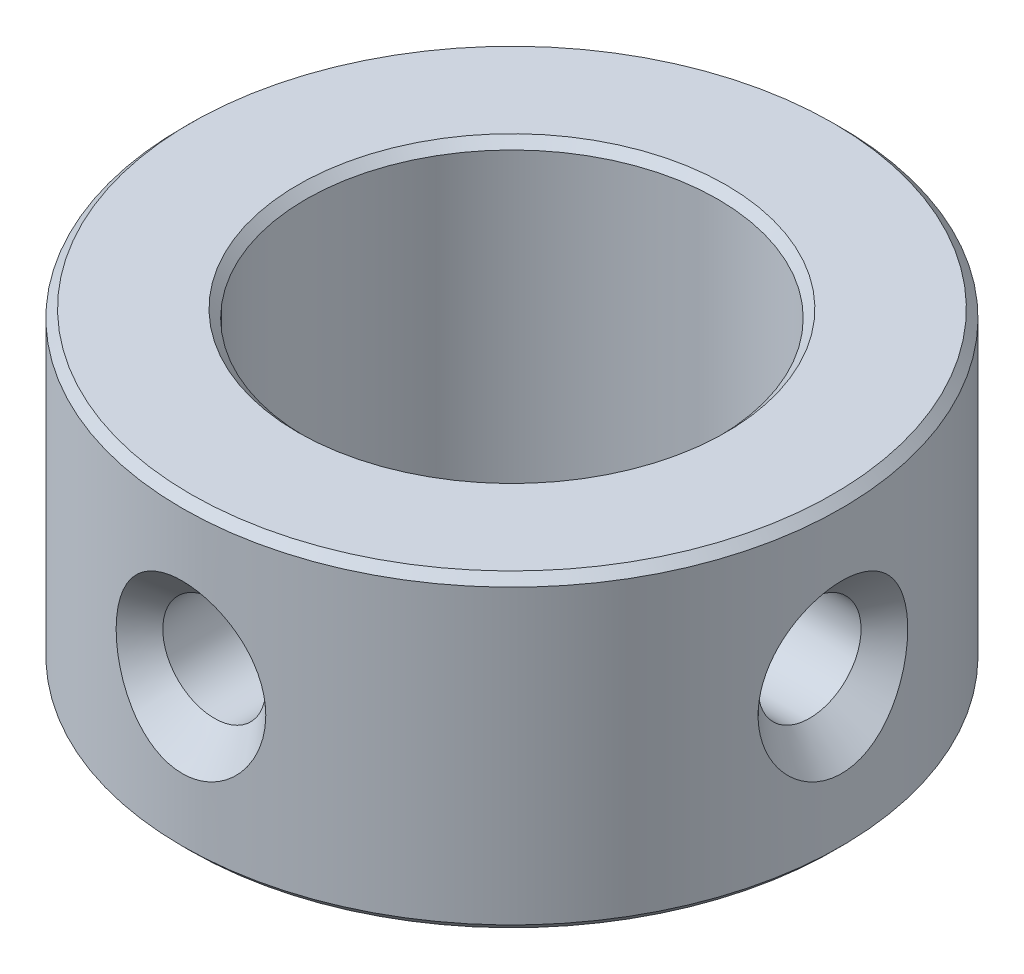
ISO-10303-21;
HEADER;
FILE_DESCRIPTION(('STEP AP214'),'2;1');
FILE_NAME('part.step','',(''),(''),'','','');
FILE_SCHEMA(('AUTOMOTIVE_DESIGN { 1 0 10303 214 1 1 1 1 }'));
ENDSEC;
DATA;
#1=APPLICATION_CONTEXT('core data for automotive mechanical design processes');
#2=APPLICATION_PROTOCOL_DEFINITION('international standard','automotive_design',2000,#1);
#3=PRODUCT_CONTEXT('',#1,'mechanical');
#4=PRODUCT('Part','Part','',(#3));
#5=PRODUCT_RELATED_PRODUCT_CATEGORY('part','',(#4));
#6=PRODUCT_DEFINITION_FORMATION('','',#4);
#7=PRODUCT_DEFINITION_CONTEXT('part definition',#1,'design');
#8=PRODUCT_DEFINITION('design','',#6,#7);
#9=PRODUCT_DEFINITION_SHAPE('','',#8);
#10=(LENGTH_UNIT() NAMED_UNIT(*) SI_UNIT(.MILLI.,.METRE.));
#11=(NAMED_UNIT(*) PLANE_ANGLE_UNIT() SI_UNIT($,.RADIAN.));
#12=(NAMED_UNIT(*) SI_UNIT($,.STERADIAN.) SOLID_ANGLE_UNIT());
#13=UNCERTAINTY_MEASURE_WITH_UNIT(LENGTH_MEASURE(1.E-05),#10,'distance_accuracy_value','');
#14=(GEOMETRIC_REPRESENTATION_CONTEXT(3) GLOBAL_UNCERTAINTY_ASSIGNED_CONTEXT((#13)) GLOBAL_UNIT_ASSIGNED_CONTEXT((#10,
#11,#12)) REPRESENTATION_CONTEXT('',''));
#15=CARTESIAN_POINT('',(0.,0.,0.));
#16=DIRECTION('',(0.,0.,1.));
#17=DIRECTION('',(1.,0.,0.));
#18=AXIS2_PLACEMENT_3D('',#15,#16,#17);
#19=CARTESIAN_POINT('',(0.,3.75,0.));
#20=DIRECTION('',(0.,1.,0.));
#21=DIRECTION('',(0.,0.,1.));
#22=AXIS2_PLACEMENT_3D('',#19,#20,#21);
#23=PLANE('',#22);
#24=CARTESIAN_POINT('',(0.,3.75,0.));
#25=DIRECTION('',(0.,1.,0.));
#26=DIRECTION('',(0.,0.,1.));
#27=AXIS2_PLACEMENT_3D('',#24,#25,#26);
#28=CIRCLE('',#27,5.2);
#29=CARTESIAN_POINT('',(0.,3.75,5.2));
#30=VERTEX_POINT('',#29);
#31=EDGE_CURVE('E41',#30,#30,#28,.F.);
#32=ORIENTED_EDGE('',*,*,#31,.T.);
#33=EDGE_LOOP('',(#32));
#34=FACE_BOUND('',#33,.T.);
#35=CARTESIAN_POINT('',(0.,3.75,0.));
#36=DIRECTION('',(0.,1.,0.));
#37=DIRECTION('',(0.,0.,1.));
#38=AXIS2_PLACEMENT_3D('',#35,#36,#37);
#39=CIRCLE('',#38,7.8);
#40=CARTESIAN_POINT('',(0.,3.75,7.8));
#41=VERTEX_POINT('',#40);
#42=EDGE_CURVE('E63',#41,#41,#39,.T.);
#43=ORIENTED_EDGE('',*,*,#42,.T.);
#44=EDGE_LOOP('',(#43));
#45=FACE_BOUND('',#44,.T.);
#46=ADVANCED_FACE('F34',(#34,#45),#23,.T.);
#47=CARTESIAN_POINT('',(0.,-3.75,0.));
#48=DIRECTION('',(0.,1.,0.));
#49=DIRECTION('',(0.,0.,1.));
#50=AXIS2_PLACEMENT_3D('',#47,#48,#49);
#51=PLANE('',#50);
#52=CARTESIAN_POINT('',(0.,-3.75,0.));
#53=DIRECTION('',(0.,1.,0.));
#54=DIRECTION('',(0.,0.,1.));
#55=AXIS2_PLACEMENT_3D('',#52,#53,#54);
#56=CIRCLE('',#55,5.2);
#57=CARTESIAN_POINT('',(0.,-3.75,5.2));
#58=VERTEX_POINT('',#57);
#59=EDGE_CURVE('E10',#58,#58,#56,.T.);
#60=ORIENTED_EDGE('',*,*,#59,.T.);
#61=EDGE_LOOP('',(#60));
#62=FACE_BOUND('',#61,.T.);
#63=CARTESIAN_POINT('',(0.,-3.75,0.));
#64=DIRECTION('',(0.,1.,0.));
#65=DIRECTION('',(0.,0.,1.));
#66=AXIS2_PLACEMENT_3D('',#63,#64,#65);
#67=CIRCLE('',#66,7.8);
#68=CARTESIAN_POINT('',(0.,-3.75,7.8));
#69=VERTEX_POINT('',#68);
#70=EDGE_CURVE('E54',#69,#69,#67,.F.);
#71=ORIENTED_EDGE('',*,*,#70,.T.);
#72=EDGE_LOOP('',(#71));
#73=FACE_BOUND('',#72,.T.);
#74=ADVANCED_FACE('F132',(#62,#73),#51,.F.);
#75=CARTESIAN_POINT('',(0.,3.75,0.));
#76=DIRECTION('',(0.,-1.,0.));
#77=DIRECTION('',(0.,0.,-1.));
#78=AXIS2_PLACEMENT_3D('',#75,#76,#77);
#79=CYLINDRICAL_SURFACE('',#78,8.);
#80=CARTESIAN_POINT('',(0.,3.55,0.));
#81=DIRECTION('',(0.,1.,0.));
#82=DIRECTION('',(0.,0.,1.));
#83=AXIS2_PLACEMENT_3D('',#80,#81,#82);
#84=CIRCLE('',#83,8.);
#85=CARTESIAN_POINT('',(0.,3.55,8.));
#86=VERTEX_POINT('',#85);
#87=EDGE_CURVE('E57',#86,#86,#84,.F.);
#88=ORIENTED_EDGE('',*,*,#87,.T.);
#89=EDGE_LOOP('',(#88));
#90=FACE_BOUND('',#89,.T.);
#91=CARTESIAN_POINT('',(0.,-3.55,0.));
#92=DIRECTION('',(0.,1.,0.));
#93=DIRECTION('',(0.,0.,1.));
#94=AXIS2_PLACEMENT_3D('',#91,#92,#93);
#95=CIRCLE('',#94,8.);
#96=CARTESIAN_POINT('',(0.,-3.55,8.));
#97=VERTEX_POINT('',#96);
#98=EDGE_CURVE('E60',#97,#97,#95,.T.);
#99=ORIENTED_EDGE('',*,*,#98,.T.);
#100=EDGE_LOOP('',(#99));
#101=FACE_BOUND('',#100,.T.);
#102=CARTESIAN_POINT('',(7.88766209710644,-1.36875477162574,-1.33595908059685));
#103=CARTESIAN_POINT('',(7.89781103552231,-1.4414286252341,-1.27603429818053));
#104=CARTESIAN_POINT('',(7.9081383203946,-1.50978786630845,-1.21092410711809));
#105=CARTESIAN_POINT('',(7.92828191149792,-1.63607735216326,-1.07113510455608));
#106=CARTESIAN_POINT('',(7.93809813738137,-1.69400596056068,-0.996454794813211));
#107=CARTESIAN_POINT('',(7.95751422673259,-1.80433598658457,-0.82826782927322));
#108=CARTESIAN_POINT('',(7.96691365686026,-1.85499227238431,-0.733577596470894));
#109=CARTESIAN_POINT('',(7.98262802779765,-1.93766030736591,-0.536115324437245));
#110=CARTESIAN_POINT('',(7.98894453445798,-1.96968152309718,-0.433347418805303));
#111=CARTESIAN_POINT('',(7.99710073240273,-2.01068415148824,-0.23484798397614));
#112=CARTESIAN_POINT('',(7.99935364163613,-2.02179796873598,-0.139571921445624));
#113=CARTESIAN_POINT('',(8.00040363119947,-2.02700021754694,0.0514400614488392));
#114=CARTESIAN_POINT('',(7.99920234256942,-2.02109668454089,0.147175743471714));
#115=CARTESIAN_POINT('',(7.99368299064805,-1.99353971527391,0.329953566160029));
#116=CARTESIAN_POINT('',(7.9895688820307,-1.97291623624104,0.417160436768698));
#117=CARTESIAN_POINT('',(7.97888924550496,-1.91805545357474,0.587003410573509));
#118=CARTESIAN_POINT('',(7.97232343057071,-1.88381655592824,0.669638977297495));
#119=CARTESIAN_POINT('',(7.95710684785922,-1.80164350628636,0.831447410075856));
#120=CARTESIAN_POINT('',(7.94838797996038,-1.75324988355686,0.910379354598936));
#121=CARTESIAN_POINT('',(7.92983729290104,-1.6451308494406,1.05989021924767));
#122=CARTESIAN_POINT('',(7.92000506202472,-1.58540124050917,1.13046602945358));
#123=CARTESIAN_POINT('',(7.89904582660171,-1.44972085183377,1.26905013470467));
#124=CARTESIAN_POINT('',(7.88789016769,-1.37273086647628,1.33603598461256));
#125=CARTESIAN_POINT('',(7.86633104820933,-1.20943589442853,1.45762002275963));
#126=CARTESIAN_POINT('',(7.85592793182822,-1.12312668986166,1.51221256681801));
#127=CARTESIAN_POINT('',(7.83578793922178,-0.93368420899724,1.61350064058194));
#128=CARTESIAN_POINT('',(7.82624234283822,-0.829739423354949,1.65872015787152));
#129=CARTESIAN_POINT('',(7.81024152158719,-0.615871494503479,1.73249973497609));
#130=CARTESIAN_POINT('',(7.80378723176595,-0.505946553622556,1.76105475474934));
#131=CARTESIAN_POINT('',(7.79436134890836,-0.275892694392124,1.80233745826448));
#132=CARTESIAN_POINT('',(7.79163227947352,-0.155555128118529,1.81396600486697));
#133=CARTESIAN_POINT('',(7.79075198907839,0.0854484195993427,1.81774165483045));
#134=CARTESIAN_POINT('',(7.79260142633618,0.206114445772796,1.80988595708527));
#135=CARTESIAN_POINT('',(7.80073010419386,0.446462607960986,1.77452638700267));
#136=CARTESIAN_POINT('',(7.80708299513201,0.566094443952362,1.74669574483184));
#137=CARTESIAN_POINT('',(7.82352991811995,0.798812680569081,1.67148212646728));
#138=CARTESIAN_POINT('',(7.83362448482233,0.911898143103936,1.62409635590782));
#139=CARTESIAN_POINT('',(7.85617363239958,1.12669357222183,1.51122432056163));
#140=CARTESIAN_POINT('',(7.86859876143102,1.22852268664282,1.44595970482076));
#141=CARTESIAN_POINT('',(7.89432126386702,1.41874134213551,1.29818903130757));
#142=CARTESIAN_POINT('',(7.90761843747953,1.50713394632294,1.21568691337547));
#143=CARTESIAN_POINT('',(7.93246835686329,1.66164276505291,1.04078913858743));
#144=CARTESIAN_POINT('',(7.94407815821557,1.72880219702167,0.949327337948772));
#145=CARTESIAN_POINT('',(7.96488454393579,1.84449878027027,0.75505110273021));
#146=CARTESIAN_POINT('',(7.97408378449348,1.89305645626681,0.652249342689261));
#147=CARTESIAN_POINT('',(7.98781799736742,1.96410335505809,0.451312314382522));
#148=CARTESIAN_POINT('',(7.99277458387603,1.98898855876391,0.354052486579373));
#149=CARTESIAN_POINT('',(7.99907701746182,2.02048546971918,0.156518181978604));
#150=CARTESIAN_POINT('',(8.00042540587232,2.02711003843476,0.0562458772972288));
#151=CARTESIAN_POINT('',(7.99938737297754,2.0219633323722,-0.134198642407214));
#152=CARTESIAN_POINT('',(7.99734430450829,2.01188339897859,-0.224423563772955));
#153=CARTESIAN_POINT('',(7.9903942901181,1.97699091937715,-0.401846849952557));
#154=CARTESIAN_POINT('',(7.98548742070105,1.95217876672711,-0.489045295550093));
#155=CARTESIAN_POINT('',(7.97332454700744,1.88894773394321,-0.658264871636935));
#156=CARTESIAN_POINT('',(7.96606573126401,1.85051256395271,-0.740279664771153));
#157=CARTESIAN_POINT('',(7.94991188720068,1.76159513342432,-0.897296732263518));
#158=CARTESIAN_POINT('',(7.94101638844481,1.71110940792094,-0.972296981040615));
#159=CARTESIAN_POINT('',(7.92157193605069,1.59495716503667,-1.12014915077485));
#160=CARTESIAN_POINT('',(7.91094652467704,1.52835569107497,-1.19225509057204));
#161=CARTESIAN_POINT('',(7.88970028540527,1.3850478979987,-1.32559327499721));
#162=CARTESIAN_POINT('',(7.8790794618174,1.3083369773454,-1.38682053797296));
#163=CARTESIAN_POINT('',(7.85762078250014,1.13766188456213,-1.50390740767079));
#164=CARTESIAN_POINT('',(7.84689440284181,1.04272763375916,-1.55837528669649));
#165=CARTESIAN_POINT('',(7.82769050557062,0.84543146813027,-1.65213681460813));
#166=CARTESIAN_POINT('',(7.8192138177182,0.743066830411459,-1.6914248671027));
#167=CARTESIAN_POINT('',(7.80478430221019,0.524863604563807,-1.75686338199667));
#168=CARTESIAN_POINT('',(7.79909327018633,0.408606654116868,-1.78168318673132));
#169=CARTESIAN_POINT('',(7.79197635299638,0.173492979797698,-1.81255498281006));
#170=CARTESIAN_POINT('',(7.79055134553896,0.0546357259951674,-1.81860311200533));
#171=CARTESIAN_POINT('',(7.79215470775396,-0.186141621833518,-1.8117236426872));
#172=CARTESIAN_POINT('',(7.79532022640392,-0.3080445698037,-1.798211677968));
#173=CARTESIAN_POINT('',(7.80597801834868,-0.547809265324001,-1.75136478762981));
#174=CARTESIAN_POINT('',(7.8134705945402,-0.665670729355821,-1.71802847428931));
#175=CARTESIAN_POINT('',(7.8312724761171,-0.886476919953176,-1.63488431518882));
#176=CARTESIAN_POINT('',(7.84136838501597,-0.989893398972423,-1.58628057084264));
#177=CARTESIAN_POINT('',(7.86344487841383,-1.18721070545209,-1.47294161599396));
#178=CARTESIAN_POINT('',(7.87542381944766,-1.28111971438651,-1.40822044388443));
#179=CARTESIAN_POINT('',(7.88766209710644,-1.36875477162574,-1.33595908059685));
#180=B_SPLINE_CURVE_WITH_KNOTS('',3,(#102,#103,#104,#105,#106,#107,#108,#109,#110,#111,#112,
#113,#114,#115,#116,#117,#118,#119,#120,#121,#122,#123,#124,#125,#126,#127,#128,#129,#130,#131,
#132,#133,#134,#135,#136,#137,#138,#139,#140,#141,#142,#143,#144,#145,#146,#147,#148,#149,#150,
#151,#152,#153,#154,#155,#156,#157,#158,#159,#160,#161,#162,#163,#164,#165,#166,#167,#168,#169,
#170,#171,#172,#173,#174,#175,#176,#177,#178,#179),.UNSPECIFIED.,.T.,.F.,(4,2,2,2,2,2,2,2,2,2,2,
2,2,2,2,2,2,2,2,2,2,2,2,2,2,2,2,2,2,2,2,2,2,2,2,2,2,2,4),(0.,0.28392792508048,0.567900354728612,
0.889441564156719,1.21081928888797,1.49713661535159,1.78331876764973,2.05122371140816,
2.31916002913897,2.59700085456465,2.87494476169208,3.18166689060421,3.48852842845147,
3.82831813350909,4.16821055201301,4.52931795360845,4.89047727196195,5.25768352956956,
5.62494227796447,5.98783937900106,6.35065362606252,6.6909135976671,7.03079704602511,
7.33066674892744,7.63032519134012,7.90145447436058,8.1725765147356,8.44402385178972,
8.71554933387908,9.01054345437876,9.3056723147691,9.63420252002207,9.96285373016412,
10.3182729082458,10.6737652066411,11.0400996569853,11.4064597540761,11.7491367222369,
12.0915162539504),.UNSPECIFIED.);
#181=CARTESIAN_POINT('',(7.88766209710644,-1.36875477162574,-1.33595908059685));
#182=VERTEX_POINT('',#181);
#183=EDGE_CURVE('E66',#182,#182,#180,.T.);
#184=ORIENTED_EDGE('',*,*,#183,.T.);
#185=EDGE_LOOP('',(#184));
#186=FACE_BOUND('',#185,.T.);
#187=CARTESIAN_POINT('',(-1.33595908059682,-1.36875477162574,7.88766209710644));
#188=CARTESIAN_POINT('',(-1.40944303777153,-1.27963328124012,7.87521663060979));
#189=CARTESIAN_POINT('',(-1.4751754482527,-1.18396169283024,7.8630310480242));
#190=CARTESIAN_POINT('',(-1.58998478810417,-0.982768950640019,7.8406243495173));
#191=CARTESIAN_POINT('',(-1.63903097970948,-0.877230071127629,7.83040687390907));
#192=CARTESIAN_POINT('',(-1.7197846566863,-0.659040217468571,7.81306964438267));
#193=CARTESIAN_POINT('',(-1.75142909299779,-0.546365009691055,7.80596117361972));
#194=CARTESIAN_POINT('',(-1.7966083868814,-0.317327894439627,7.79568713804951));
#195=CARTESIAN_POINT('',(-1.81015004894302,-0.20096738904467,7.79252009176648));
#196=CARTESIAN_POINT('',(-1.81912690093356,0.0375541003684798,7.79043051240186));
#197=CARTESIAN_POINT('',(-1.81375255546961,0.159748051786066,7.7916977364872));
#198=CARTESIAN_POINT('',(-1.78316985558781,0.401526905792244,7.79875284080626));
#199=CARTESIAN_POINT('',(-1.7579562950191,0.521111115072941,7.80454190764629));
#200=CARTESIAN_POINT('',(-1.68797509817015,0.754678135856541,7.81997590276495));
#201=CARTESIAN_POINT('',(-1.64313222537074,0.868637499222224,7.82963565468714));
#202=CARTESIAN_POINT('',(-1.53459227889633,1.08697091740285,7.85162918503102));
#203=CARTESIAN_POINT('',(-1.47089394056544,1.19134432866246,7.86396314279966));
#204=CARTESIAN_POINT('',(-1.32787380544344,1.38394389747925,7.88935093709948));
#205=CARTESIAN_POINT('',(-1.24906617594473,1.47255445402449,7.9023729646794));
#206=CARTESIAN_POINT('',(-1.07624454948179,1.63361969726082,7.92775432716441));
#207=CARTESIAN_POINT('',(-0.982240552060119,1.70608493385718,7.94011409078095));
#208=CARTESIAN_POINT('',(-0.79061247210154,1.82538818356649,7.96136628250515));
#209=CARTESIAN_POINT('',(-0.69409294335025,1.87395619323951,7.97047169136296));
#210=CARTESIAN_POINT('',(-0.493362812086154,1.95187494459024,7.98540336949179));
#211=CARTESIAN_POINT('',(-0.389160830878532,1.98124687368938,7.99123325307974));
#212=CARTESIAN_POINT('',(-0.189694909948285,2.01661473852397,7.99829721116927));
#213=CARTESIAN_POINT('',(-0.0948670486129899,2.02500106783029,8.0000004438111));
#214=CARTESIAN_POINT('',(0.0947751515084338,2.02499893199174,7.99999955623128));
#215=CARTESIAN_POINT('',(0.189589483759011,2.01661622526808,7.99829660567961));
#216=CARTESIAN_POINT('',(0.370809730932551,1.98451694841217,7.99188722859812));
#217=CARTESIAN_POINT('',(0.457385809552344,1.96170874588219,7.98735892720726));
#218=CARTESIAN_POINT('',(0.625658222200896,1.90269415719664,7.97594322581105));
#219=CARTESIAN_POINT('',(0.707353931616675,1.86648606030711,7.96905552459485));
#220=CARTESIAN_POINT('',(0.867569492170292,1.78026547187512,7.95324421338002));
#221=CARTESIAN_POINT('',(0.945791217111726,1.72971545485633,7.9442443268816));
#222=CARTESIAN_POINT('',(1.09358950647522,1.61742972276801,7.92525239714604));
#223=CARTESIAN_POINT('',(1.16316271346547,1.55568968635356,7.91525997128766));
#224=CARTESIAN_POINT('',(1.29954042216669,1.41578666349428,7.89407723621862));
#225=CARTESIAN_POINT('',(1.36526761175843,1.33657615589086,7.88287233695986));
#226=CARTESIAN_POINT('',(1.48400187279958,1.16902916281141,7.86138577229738));
#227=CARTESIAN_POINT('',(1.53700319890389,1.08068858102978,7.85110452520086));
#228=CARTESIAN_POINT('',(1.63450481137137,0.887403707645067,7.83141963516629));
#229=CARTESIAN_POINT('',(1.67752592730855,0.781690202917847,7.82222183509354));
#230=CARTESIAN_POINT('',(1.74661069991577,0.564638279797977,7.80708679845405));
#231=CARTESIAN_POINT('',(1.77266951557473,0.453298265370823,7.80115049278747));
#232=CARTESIAN_POINT('',(1.80845440681822,0.221213054972745,7.79293665356938));
#233=CARTESIAN_POINT('',(1.81714026649163,0.100297867187098,7.79089247887507));
#234=CARTESIAN_POINT('',(1.81492795759776,-0.14135115663399,7.79140775037289));
#235=CARTESIAN_POINT('',(1.80402704622598,-0.262084964900686,7.7939678413166));
#236=CARTESIAN_POINT('',(1.76252654275359,-0.501730670074366,7.80345808549174));
#237=CARTESIAN_POINT('',(1.7316488081271,-0.620592183231181,7.81044991465534));
#238=CARTESIAN_POINT('',(1.65043457115164,-0.851232621719874,7.82801267019195));
#239=CARTESIAN_POINT('',(1.60009536179655,-0.963010559238733,7.83858409444561));
#240=CARTESIAN_POINT('',(1.48165145405798,-1.17437241089617,7.86182474204769));
#241=CARTESIAN_POINT('',(1.41381486637922,-1.27410960320468,7.87446133375991));
#242=CARTESIAN_POINT('',(1.26120217541879,-1.45963714957304,7.90033767731509));
#243=CARTESIAN_POINT('',(1.17643106707287,-1.54543160262501,7.9135772504183));
#244=CARTESIAN_POINT('',(0.998011107973364,-1.69401401433269,7.93797921346679));
#245=CARTESIAN_POINT('',(0.90534288426297,-1.75796127121415,7.94922142034198));
#246=CARTESIAN_POINT('',(0.709272827989419,-1.86703609042369,7.96910186557969));
#247=CARTESIAN_POINT('',(0.605883243087173,-1.91218483795794,7.97774303215506));
#248=CARTESIAN_POINT('',(0.404716248952393,-1.97672877790154,7.99031415496274));
#249=CARTESIAN_POINT('',(0.307745877773974,-1.9985577744658,7.99468387782547));
#250=CARTESIAN_POINT('',(0.11137486601841,-2.02417709809171,7.99982573772534));
#251=CARTESIAN_POINT('',(0.0119759014518737,-2.02797953080607,8.00060028907539));
#252=CARTESIAN_POINT('',(-0.176892672327146,-2.01782244033892,7.99855206823825));
#253=CARTESIAN_POINT('',(-0.266454487385794,-2.00542272030253,7.99604516687026));
#254=CARTESIAN_POINT('',(-0.442220820235402,-1.96614357552015,7.98825273168375));
#255=CARTESIAN_POINT('',(-0.528424674856496,-1.93926130597916,7.98296665195849));
#256=CARTESIAN_POINT('',(-0.696088816247197,-1.87192858562971,7.97010727109852));
#257=CARTESIAN_POINT('',(-0.777496193837674,-1.83135152945414,7.96251269602614));
#258=CARTESIAN_POINT('',(-0.932957494013871,-1.73832233512111,7.94579796801077));
#259=CARTESIAN_POINT('',(-1.00701547317598,-1.68587680092784,7.93667866420511));
#260=CARTESIAN_POINT('',(-1.12407234615611,-1.58941372147517,7.92077931438588));
#261=CARTESIAN_POINT('',(-1.16938805142687,-1.54812863237362,7.91419273924553));
#262=CARTESIAN_POINT('',(-1.25584865520945,-1.46142780527151,7.90093378320774));
#263=CARTESIAN_POINT('',(-1.29699363239536,-1.4160121452182,7.89426140393154));
#264=CARTESIAN_POINT('',(-1.33595908059682,-1.36875477162574,7.88766209710644));
#265=B_SPLINE_CURVE_WITH_KNOTS('',3,(#187,#188,#189,#190,#191,#192,#193,#194,#195,#196,#197,
#198,#199,#200,#201,#202,#203,#204,#205,#206,#207,#208,#209,#210,#211,#212,#213,#214,#215,#216,
#217,#218,#219,#220,#221,#222,#223,#224,#225,#226,#227,#228,#229,#230,#231,#232,#233,#234,#235,
#236,#237,#238,#239,#240,#241,#242,#243,#244,#245,#246,#247,#248,#249,#250,#251,#252,#253,#254,
#255,#256,#257,#258,#259,#260,#261,#262,#263,#264),.UNSPECIFIED.,.T.,.F.,(4,2,2,2,2,2,2,2,2,2,2,
2,2,2,2,2,2,2,2,2,2,2,2,2,2,2,2,2,2,2,2,2,2,2,2,2,2,2,4),(0.,0.348306093920295,
0.697250373470942,1.04745073564415,1.39751942709634,1.7627485627584,2.12807357279693,
2.49481125585327,2.86157354196718,3.21755719577478,3.5733075509734,3.89674166179198,
4.21981818086019,4.50396250994394,4.78800928172883,5.05574157516836,5.32350806117745,
5.60306209803105,5.88272432356568,6.19206433026372,6.50154373318356,6.84355348581516,
7.18566080468985,7.54770319795976,7.90979629325175,8.2770426765485,8.64434016060228,
9.00631322017014,9.3681796708921,9.70570674455812,10.0428524016858,10.3396868480256,
10.6363219283492,10.9063983305383,11.1765278029609,11.4492262728374,11.7217733768772,
11.9064689165211,12.0911609715316),.UNSPECIFIED.);
#266=CARTESIAN_POINT('',(-1.33595908059682,-1.36875477162574,7.88766209710644));
#267=VERTEX_POINT('',#266);
#268=EDGE_CURVE('E74',#267,#267,#265,.T.);
#269=ORIENTED_EDGE('',*,*,#268,.T.);
#270=EDGE_LOOP('',(#269));
#271=FACE_BOUND('',#270,.T.);
#272=ADVANCED_FACE('F80',(#90,#101,#186,#271),#79,.T.);
#273=CARTESIAN_POINT('',(0.,3.75,0.));
#274=DIRECTION('',(0.,-1.,0.));
#275=DIRECTION('',(0.,0.,-1.));
#276=AXIS2_PLACEMENT_3D('',#273,#274,#275);
#277=CYLINDRICAL_SURFACE('',#276,5.);
#278=CARTESIAN_POINT('',(0.,3.55,0.));
#279=DIRECTION('',(0.,1.,0.));
#280=DIRECTION('',(0.,0.,1.));
#281=AXIS2_PLACEMENT_3D('',#278,#279,#280);
#282=CIRCLE('',#281,5.);
#283=CARTESIAN_POINT('',(0.,3.55,5.));
#284=VERTEX_POINT('',#283);
#285=EDGE_CURVE('E45',#284,#284,#282,.T.);
#286=ORIENTED_EDGE('',*,*,#285,.T.);
#287=EDGE_LOOP('',(#286));
#288=FACE_BOUND('',#287,.T.);
#289=CARTESIAN_POINT('',(0.,-3.55,0.));
#290=DIRECTION('',(0.,1.,0.));
#291=DIRECTION('',(0.,0.,1.));
#292=AXIS2_PLACEMENT_3D('',#289,#290,#291);
#293=CIRCLE('',#292,5.);
#294=CARTESIAN_POINT('',(0.,-3.55,5.));
#295=VERTEX_POINT('',#294);
#296=EDGE_CURVE('E49',#295,#295,#293,.F.);
#297=ORIENTED_EDGE('',*,*,#296,.T.);
#298=EDGE_LOOP('',(#297));
#299=FACE_BOUND('',#298,.T.);
#300=CARTESIAN_POINT('',(4.84122918275927,0.,-1.25000000000002));
#301=CARTESIAN_POINT('',(4.84123050042654,-0.0690253754623046,-1.2499980392959));
#302=CARTESIAN_POINT('',(4.84272153006956,-0.138072449338997,-1.24426312274867));
#303=CARTESIAN_POINT('',(4.84850930996624,-0.274183789087018,-1.22151156273209));
#304=CARTESIAN_POINT('',(4.85280769310906,-0.341246877234163,-1.20448835337111));
#305=CARTESIAN_POINT('',(4.86369362297983,-0.47140176909352,-1.15974559981599));
#306=CARTESIAN_POINT('',(4.87027821345204,-0.534498577692835,-1.13203986392725));
#307=CARTESIAN_POINT('',(4.88499096014404,-0.655155426269959,-1.06676057063072));
#308=CARTESIAN_POINT('',(4.89311918189251,-0.712715231040113,-1.02918659428036));
#309=CARTESIAN_POINT('',(4.91020358177805,-0.821930822631102,-0.944354213655954));
#310=CARTESIAN_POINT('',(4.91917298811515,-0.873446800175021,-0.896918443852041));
#311=CARTESIAN_POINT('',(4.93681437757648,-0.96788069718017,-0.794091032050349));
#312=CARTESIAN_POINT('',(4.94548633283194,-1.01079781281087,-0.73869864709017));
#313=CARTESIAN_POINT('',(4.96170207760291,-1.08738773381564,-0.620572600539494));
#314=CARTESIAN_POINT('',(4.96922843700296,-1.12092319408073,-0.557747288097577));
#315=CARTESIAN_POINT('',(4.98215405962992,-1.17690482207654,-0.427131592146398));
#316=CARTESIAN_POINT('',(4.98755363667172,-1.19935262595776,-0.359341942895987));
#317=CARTESIAN_POINT('',(4.9955237942409,-1.23207391728929,-0.222179379377098));
#318=CARTESIAN_POINT('',(4.99814946922157,-1.24258482216329,-0.152866359774505));
#319=CARTESIAN_POINT('',(5.00046797053649,-1.25187918963778,-0.0134144096314022));
#320=CARTESIAN_POINT('',(5.00016123048352,-1.2506643861048,0.0567243972690167));
#321=CARTESIAN_POINT('',(4.99669047476767,-1.23671257487493,0.194190308965466));
#322=CARTESIAN_POINT('',(4.99359001170437,-1.22423183747307,0.261545269501316));
#323=CARTESIAN_POINT('',(4.98495418262427,-1.18851436497575,0.39317280926709));
#324=CARTESIAN_POINT('',(4.97941868699221,-1.16527705731129,0.45744522421303));
#325=CARTESIAN_POINT('',(4.96643754850448,-1.10849871465647,0.58175837937724));
#326=CARTESIAN_POINT('',(4.95897509847527,-1.07486647766913,0.641755637208112));
#327=CARTESIAN_POINT('',(4.94294951904825,-0.99832216044187,0.755344527925593));
#328=CARTESIAN_POINT('',(4.93438619826245,-0.955408465719689,0.808935043856864));
#329=CARTESIAN_POINT('',(4.91681856884761,-0.860145629008811,0.909717543856177));
#330=CARTESIAN_POINT('',(4.90780859762959,-0.807572553826113,0.956697098843981));
#331=CARTESIAN_POINT('',(4.89057521758354,-0.695200013229874,1.04122046995376));
#332=CARTESIAN_POINT('',(4.88235184552986,-0.635400210254499,1.0787638450575));
#333=CARTESIAN_POINT('',(4.86760248415825,-0.509854982925517,1.14348516127823));
#334=CARTESIAN_POINT('',(4.86108491862861,-0.444082134843402,1.1706119587131));
#335=CARTESIAN_POINT('',(4.85059320069979,-0.308707265961774,1.21335702579541));
#336=CARTESIAN_POINT('',(4.8466185040511,-0.239106068008432,1.22897775819112));
#337=CARTESIAN_POINT('',(4.84177678019571,-0.10002024923844,1.24791481933257));
#338=CARTESIAN_POINT('',(4.84083044546824,-0.0305811033351858,1.2515452369598));
#339=CARTESIAN_POINT('',(4.8419367174052,0.107910968289079,1.24725849525776));
#340=CARTESIAN_POINT('',(4.84398904800633,0.17696392897562,1.23934239892438));
#341=CARTESIAN_POINT('',(4.85078540977281,0.311557132477353,1.21246273196881));
#342=CARTESIAN_POINT('',(4.85548485117188,0.377136363285422,1.19368203414085));
#343=CARTESIAN_POINT('',(4.86700359135482,0.504215728925841,1.14580904083529));
#344=CARTESIAN_POINT('',(4.87382314124307,0.56571537952767,1.11671552385625));
#345=CARTESIAN_POINT('',(4.88898068546632,0.684220638933674,1.04838533396826));
#346=CARTESIAN_POINT('',(4.89734584303321,0.741114420021551,1.0089608769178));
#347=CARTESIAN_POINT('',(4.91458541535858,0.847594181400676,0.921325366168051));
#348=CARTESIAN_POINT('',(4.92345991364235,0.897178958325036,0.873112868506781));
#349=CARTESIAN_POINT('',(4.94098701515803,0.988905521285478,0.767828401230889));
#350=CARTESIAN_POINT('',(4.94962851030918,1.03083003127441,0.710564940664473));
#351=CARTESIAN_POINT('',(4.96548608306867,1.10446793347562,0.589628353368326));
#352=CARTESIAN_POINT('',(4.9727022350198,1.1361818583041,0.525955561196971));
#353=CARTESIAN_POINT('',(4.98485057869157,1.18822301726396,0.394447752163845));
#354=CARTESIAN_POINT('',(4.98979915011205,1.20863214218953,0.326646726284834));
#355=CARTESIAN_POINT('',(4.99692646697894,1.23773016730421,0.188437200398492));
#356=CARTESIAN_POINT('',(4.99910574696704,1.24642132936952,0.118029206301537));
#357=CARTESIAN_POINT('',(5.00042711761014,1.25170948696942,-0.0213544080541755));
#358=CARTESIAN_POINT('',(4.9996497360001,1.24862713636924,-0.0903172837075588));
#359=CARTESIAN_POINT('',(4.99532370571779,1.23119021588208,-0.226709370518442));
#360=CARTESIAN_POINT('',(4.99177513946369,1.21683598123362,-0.294138627226125));
#361=CARTESIAN_POINT('',(4.98231791067453,1.17743472528634,-0.425213794556037));
#362=CARTESIAN_POINT('',(4.97642205628333,1.15244568335672,-0.488878118226291));
#363=CARTESIAN_POINT('',(4.9628911114173,1.09253677622584,-0.611146316301852));
#364=CARTESIAN_POINT('',(4.9552558017217,1.05761565916304,-0.669749551581331));
#365=CARTESIAN_POINT('',(4.93884062101666,0.977855957503657,-0.781752410529891));
#366=CARTESIAN_POINT('',(4.93003771182014,0.932799821365776,-0.834993735375747));
#367=CARTESIAN_POINT('',(4.91238311316552,0.834471435032751,-0.933268775339085));
#368=CARTESIAN_POINT('',(4.90353141190694,0.781197104877616,-0.978300406335253));
#369=CARTESIAN_POINT('',(4.88659344825685,0.666748232248333,-1.05970253309905));
#370=CARTESIAN_POINT('',(4.87852454662355,0.605444845734214,-1.0958957743082));
#371=CARTESIAN_POINT('',(4.86429944438269,0.477430637596623,-1.1574086207696));
#372=CARTESIAN_POINT('',(4.85814185308378,0.410723792366572,-1.18273613719966));
#373=CARTESIAN_POINT('',(4.84939885924729,0.286778735216604,-1.21802816070681));
#374=CARTESIAN_POINT('',(4.84635828750683,0.230133544520173,-1.22999146324424));
#375=CARTESIAN_POINT('',(4.84227298231965,0.115663913750045,-1.2459778657166));
#376=CARTESIAN_POINT('',(4.84122807862453,0.0578395746936729,-1.25000164296525));
#377=CARTESIAN_POINT('',(4.84122918275927,0.,-1.25000000000002));
#378=B_SPLINE_CURVE_WITH_KNOTS('',3,(#300,#301,#302,#303,#304,#305,#306,#307,#308,#309,#310,
#311,#312,#313,#314,#315,#316,#317,#318,#319,#320,#321,#322,#323,#324,#325,#326,#327,#328,#329,
#330,#331,#332,#333,#334,#335,#336,#337,#338,#339,#340,#341,#342,#343,#344,#345,#346,#347,#348,
#349,#350,#351,#352,#353,#354,#355,#356,#357,#358,#359,#360,#361,#362,#363,#364,#365,#366,#367,
#368,#369,#370,#371,#372,#373,#374,#375,#376,#377),.UNSPECIFIED.,.T.,.F.,(4,2,2,2,2,2,2,2,2,2,2,
2,2,2,2,2,2,2,2,2,2,2,2,2,2,2,2,2,2,2,2,2,2,2,2,2,2,2,4),(0.,0.206863720868068,
0.413847870714333,0.62056536358301,0.827291633777392,1.03811977096488,1.24896760739933,
1.4627574819896,1.67651579923546,1.88594375497673,2.0953407433301,2.30009131344473,
2.50485278362393,2.71146437127222,2.91811192734456,3.13035233285956,3.34260265599901,
3.55588216004201,3.76911600064773,3.97671787380858,4.18430063591901,4.38848702504603,
4.59269760710708,4.80091422929578,5.00916509442522,5.22262665482659,5.43607707859776,
5.64796036403464,5.85980274454519,6.06591723063728,6.2720255868849,6.47702438279855,
6.68204902869036,6.89198548291035,7.10197515782754,7.31588238642338,7.52963360683309,
7.70298913588664,7.8763298754976),.UNSPECIFIED.);
#379=CARTESIAN_POINT('',(4.84122918275927,0.,-1.25000000000002));
#380=VERTEX_POINT('',#379);
#381=EDGE_CURVE('E98',#380,#380,#378,.T.);
#382=ORIENTED_EDGE('',*,*,#381,.F.);
#383=EDGE_LOOP('',(#382));
#384=FACE_BOUND('',#383,.T.);
#385=CARTESIAN_POINT('',(1.25,0.,4.84122918275927));
#386=CARTESIAN_POINT('',(1.24999803929589,-0.0690253754623047,4.84123050042654));
#387=CARTESIAN_POINT('',(1.24426312274865,-0.138072449338997,4.84272153006957));
#388=CARTESIAN_POINT('',(1.22151156273207,-0.274183789087018,4.84850930996624));
#389=CARTESIAN_POINT('',(1.2044883533711,-0.341246877234163,4.85280769310907));
#390=CARTESIAN_POINT('',(1.15974559981597,-0.47140176909352,4.86369362297984));
#391=CARTESIAN_POINT('',(1.13203986392723,-0.534498577692834,4.87027821345204));
#392=CARTESIAN_POINT('',(1.0667605706307,-0.655155426269959,4.88499096014404));
#393=CARTESIAN_POINT('',(1.02918659428035,-0.712715231040113,4.89311918189251));
#394=CARTESIAN_POINT('',(0.944354213655936,-0.821930822631102,4.91020358177806));
#395=CARTESIAN_POINT('',(0.896918443852023,-0.873446800175022,4.91917298811515));
#396=CARTESIAN_POINT('',(0.794091032050331,-0.96788069718017,4.93681437757649));
#397=CARTESIAN_POINT('',(0.738698647090153,-1.01079781281087,4.94548633283195));
#398=CARTESIAN_POINT('',(0.620572600539477,-1.08738773381564,4.96170207760291));
#399=CARTESIAN_POINT('',(0.55774728809756,-1.12092319408073,4.96922843700296));
#400=CARTESIAN_POINT('',(0.427131592146381,-1.17690482207654,4.98215405962992));
#401=CARTESIAN_POINT('',(0.35934194289597,-1.19935262595776,4.98755363667172));
#402=CARTESIAN_POINT('',(0.222179379377081,-1.23207391728929,4.9955237942409));
#403=CARTESIAN_POINT('',(0.152866359774488,-1.24258482216329,4.99814946922157));
#404=CARTESIAN_POINT('',(0.0134144096313849,-1.25187918963778,5.00046797053649));
#405=CARTESIAN_POINT('',(-0.056724397269034,-1.2506643861048,5.00016123048352));
#406=CARTESIAN_POINT('',(-0.194190308965484,-1.23671257487493,4.99669047476767));
#407=CARTESIAN_POINT('',(-0.261545269501333,-1.22423183747307,4.99359001170437));
#408=CARTESIAN_POINT('',(-0.393172809267107,-1.18851436497575,4.98495418262427));
#409=CARTESIAN_POINT('',(-0.457445224213047,-1.16527705731129,4.9794186869922));
#410=CARTESIAN_POINT('',(-0.581758379377257,-1.10849871465647,4.96643754850448));
#411=CARTESIAN_POINT('',(-0.64175563720813,-1.07486647766913,4.95897509847527));
#412=CARTESIAN_POINT('',(-0.75534452792561,-0.99832216044187,4.94294951904825));
#413=CARTESIAN_POINT('',(-0.808935043856881,-0.955408465719689,4.93438619826245));
#414=CARTESIAN_POINT('',(-0.909717543856194,-0.860145629008811,4.9168185688476));
#415=CARTESIAN_POINT('',(-0.956697098843998,-0.807572553826113,4.90780859762959));
#416=CARTESIAN_POINT('',(-1.04122046995377,-0.695200013229874,4.89057521758353));
#417=CARTESIAN_POINT('',(-1.07876384505752,-0.6354002102545,4.88235184552985));
#418=CARTESIAN_POINT('',(-1.14348516127825,-0.509854982925517,4.86760248415824));
#419=CARTESIAN_POINT('',(-1.17061195871311,-0.444082134843402,4.8610849186286));
#420=CARTESIAN_POINT('',(-1.21335702579542,-0.308707265961774,4.85059320069978));
#421=CARTESIAN_POINT('',(-1.22897775819114,-0.239106068008432,4.84661850405109));
#422=CARTESIAN_POINT('',(-1.24791481933259,-0.10002024923844,4.8417767801957));
#423=CARTESIAN_POINT('',(-1.25154523695981,-0.0305811033351859,4.84083044546824));
#424=CARTESIAN_POINT('',(-1.24725849525777,0.107910968289079,4.8419367174052));
#425=CARTESIAN_POINT('',(-1.2393423989244,0.17696392897562,4.84398904800633));
#426=CARTESIAN_POINT('',(-1.21246273196883,0.311557132477353,4.8507854097728));
#427=CARTESIAN_POINT('',(-1.19368203414087,0.377136363285421,4.85548485117188));
#428=CARTESIAN_POINT('',(-1.14580904083531,0.504215728925841,4.86700359135481));
#429=CARTESIAN_POINT('',(-1.11671552385627,0.565715379527669,4.87382314124307));
#430=CARTESIAN_POINT('',(-1.04838533396828,0.684220638933674,4.88898068546631));
#431=CARTESIAN_POINT('',(-1.00896087691781,0.74111442002155,4.89734584303321));
#432=CARTESIAN_POINT('',(-0.921325366168069,0.847594181400676,4.91458541535858));
#433=CARTESIAN_POINT('',(-0.873112868506798,0.897178958325036,4.92345991364235));
#434=CARTESIAN_POINT('',(-0.767828401230907,0.988905521285477,4.94098701515803));
#435=CARTESIAN_POINT('',(-0.71056494066449,1.03083003127441,4.94962851030918));
#436=CARTESIAN_POINT('',(-0.589628353368344,1.10446793347562,4.96548608306867));
#437=CARTESIAN_POINT('',(-0.525955561196989,1.1361818583041,4.9727022350198));
#438=CARTESIAN_POINT('',(-0.394447752163863,1.18822301726396,4.98485057869157));
#439=CARTESIAN_POINT('',(-0.326646726284852,1.20863214218953,4.98979915011205));
#440=CARTESIAN_POINT('',(-0.18843720039851,1.23773016730421,4.99692646697894));
#441=CARTESIAN_POINT('',(-0.118029206301555,1.24642132936952,4.99910574696704));
#442=CARTESIAN_POINT('',(0.0213544080541577,1.25170948696942,5.00042711761014));
#443=CARTESIAN_POINT('',(0.0903172837075411,1.24862713636924,4.9996497360001));
#444=CARTESIAN_POINT('',(0.226709370518424,1.23119021588208,4.9953237057178));
#445=CARTESIAN_POINT('',(0.294138627226108,1.21683598123362,4.99177513946369));
#446=CARTESIAN_POINT('',(0.42521379455602,1.17743472528634,4.98231791067453));
#447=CARTESIAN_POINT('',(0.488878118226273,1.15244568335672,4.97642205628333));
#448=CARTESIAN_POINT('',(0.611146316301835,1.09253677622584,4.9628911114173));
#449=CARTESIAN_POINT('',(0.669749551581313,1.05761565916304,4.9552558017217));
#450=CARTESIAN_POINT('',(0.781752410529873,0.977855957503657,4.93884062101666));
#451=CARTESIAN_POINT('',(0.834993735375729,0.932799821365777,4.93003771182014));
#452=CARTESIAN_POINT('',(0.933268775339068,0.834471435032752,4.91238311316553));
#453=CARTESIAN_POINT('',(0.978300406335236,0.781197104877617,4.90353141190695));
#454=CARTESIAN_POINT('',(1.05970253309903,0.666748232248334,4.88659344825685));
#455=CARTESIAN_POINT('',(1.09589577430819,0.605444845734215,4.87852454662356));
#456=CARTESIAN_POINT('',(1.15740862076958,0.477430637596623,4.8642994443827));
#457=CARTESIAN_POINT('',(1.18273613719965,0.410723792366572,4.85814185308378));
#458=CARTESIAN_POINT('',(1.2180281607068,0.286778735216605,4.84939885924729));
#459=CARTESIAN_POINT('',(1.22999146324422,0.230133544520174,4.84635828750683));
#460=CARTESIAN_POINT('',(1.24597786571658,0.115663913750045,4.84227298231965));
#461=CARTESIAN_POINT('',(1.25000164296523,0.0578395746936729,4.84122807862454));
#462=CARTESIAN_POINT('',(1.25,0.,4.84122918275927));
#463=B_SPLINE_CURVE_WITH_KNOTS('',3,(#385,#386,#387,#388,#389,#390,#391,#392,#393,#394,#395,
#396,#397,#398,#399,#400,#401,#402,#403,#404,#405,#406,#407,#408,#409,#410,#411,#412,#413,#414,
#415,#416,#417,#418,#419,#420,#421,#422,#423,#424,#425,#426,#427,#428,#429,#430,#431,#432,#433,
#434,#435,#436,#437,#438,#439,#440,#441,#442,#443,#444,#445,#446,#447,#448,#449,#450,#451,#452,
#453,#454,#455,#456,#457,#458,#459,#460,#461,#462),.UNSPECIFIED.,.T.,.F.,(4,2,2,2,2,2,2,2,2,2,2,
2,2,2,2,2,2,2,2,2,2,2,2,2,2,2,2,2,2,2,2,2,2,2,2,2,2,2,4),(0.,0.206863720868068,
0.413847870714333,0.62056536358301,0.827291633777392,1.03811977096488,1.24896760739933,
1.4627574819896,1.67651579923546,1.88594375497673,2.0953407433301,2.30009131344473,
2.50485278362393,2.71146437127222,2.91811192734456,3.13035233285956,3.34260265599901,
3.55588216004201,3.76911600064773,3.97671787380858,4.18430063591901,4.38848702504603,
4.59269760710708,4.80091422929578,5.00916509442522,5.22262665482659,5.43607707859776,
5.64796036403464,5.85980274454519,6.06591723063728,6.2720255868849,6.47702438279855,
6.68204902869036,6.89198548291035,7.10197515782754,7.31588238642338,7.52963360683309,
7.70298913588664,7.8763298754976),.UNSPECIFIED.);
#464=CARTESIAN_POINT('',(1.25,0.,4.84122918275927));
#465=VERTEX_POINT('',#464);
#466=EDGE_CURVE('E108',#465,#465,#463,.T.);
#467=ORIENTED_EDGE('',*,*,#466,.F.);
#468=EDGE_LOOP('',(#467));
#469=FACE_BOUND('',#468,.T.);
#470=ADVANCED_FACE('F123',(#288,#299,#384,#469),#277,.F.);
#471=CARTESIAN_POINT('',(0.,0.,8.));
#472=DIRECTION('',(0.,0.,1.));
#473=DIRECTION('',(1.,0.,0.));
#474=AXIS2_PLACEMENT_3D('',#471,#472,#473);
#475=CONICAL_SURFACE('',#474,2.025,0.785398163397449);
#476=CARTESIAN_POINT('',(0.,0.,7.225));
#477=DIRECTION('',(0.,0.,1.));
#478=DIRECTION('',(1.,0.,0.));
#479=AXIS2_PLACEMENT_3D('',#476,#477,#478);
#480=CIRCLE('',#479,1.25);
#481=CARTESIAN_POINT('',(1.25,0.,7.225));
#482=VERTEX_POINT('',#481);
#483=EDGE_CURVE('E105',#482,#482,#480,.T.);
#484=ORIENTED_EDGE('',*,*,#483,.F.);
#485=EDGE_LOOP('',(#484));
#486=FACE_BOUND('',#485,.T.);
#487=ORIENTED_EDGE('',*,*,#268,.F.);
#488=EDGE_LOOP('',(#487));
#489=FACE_BOUND('',#488,.T.);
#490=ADVANCED_FACE('F119',(#486,#489),#475,.F.);
#491=CARTESIAN_POINT('',(0.,0.,8.));
#492=DIRECTION('',(0.,0.,1.));
#493=DIRECTION('',(1.,0.,0.));
#494=AXIS2_PLACEMENT_3D('',#491,#492,#493);
#495=CYLINDRICAL_SURFACE('',#494,1.25);
#496=ORIENTED_EDGE('',*,*,#483,.T.);
#497=EDGE_LOOP('',(#496));
#498=FACE_BOUND('',#497,.T.);
#499=ORIENTED_EDGE('',*,*,#466,.T.);
#500=EDGE_LOOP('',(#499));
#501=FACE_BOUND('',#500,.T.);
#502=ADVANCED_FACE('F89',(#498,#501),#495,.F.);
#503=CARTESIAN_POINT('',(8.,0.,0.));
#504=DIRECTION('',(1.,0.,0.));
#505=DIRECTION('',(0.,0.,-1.));
#506=AXIS2_PLACEMENT_3D('',#503,#504,#505);
#507=CONICAL_SURFACE('',#506,2.025,0.785398163397449);
#508=CARTESIAN_POINT('',(7.225,0.,0.));
#509=DIRECTION('',(1.,0.,0.));
#510=DIRECTION('',(0.,0.,-1.));
#511=AXIS2_PLACEMENT_3D('',#508,#509,#510);
#512=CIRCLE('',#511,1.25);
#513=CARTESIAN_POINT('',(7.225,0.,-1.25000000000002));
#514=VERTEX_POINT('',#513);
#515=EDGE_CURVE('E106',#514,#514,#512,.T.);
#516=ORIENTED_EDGE('',*,*,#515,.F.);
#517=EDGE_LOOP('',(#516));
#518=FACE_BOUND('',#517,.T.);
#519=ORIENTED_EDGE('',*,*,#183,.F.);
#520=EDGE_LOOP('',(#519));
#521=FACE_BOUND('',#520,.T.);
#522=ADVANCED_FACE('F84',(#518,#521),#507,.F.);
#523=CARTESIAN_POINT('',(8.,0.,0.));
#524=DIRECTION('',(1.,0.,0.));
#525=DIRECTION('',(0.,0.,-1.));
#526=AXIS2_PLACEMENT_3D('',#523,#524,#525);
#527=CYLINDRICAL_SURFACE('',#526,1.25);
#528=ORIENTED_EDGE('',*,*,#515,.T.);
#529=EDGE_LOOP('',(#528));
#530=FACE_BOUND('',#529,.T.);
#531=ORIENTED_EDGE('',*,*,#381,.T.);
#532=EDGE_LOOP('',(#531));
#533=FACE_BOUND('',#532,.T.);
#534=ADVANCED_FACE('F88',(#530,#533),#527,.F.);
#535=CARTESIAN_POINT('',(0.,3.75,0.));
#536=DIRECTION('',(0.,-1.,0.));
#537=DIRECTION('',(0.,0.,-1.));
#538=AXIS2_PLACEMENT_3D('',#535,#536,#537);
#539=CONICAL_SURFACE('',#538,7.8,0.785398163397457);
#540=ORIENTED_EDGE('',*,*,#87,.F.);
#541=EDGE_LOOP('',(#540));
#542=FACE_BOUND('',#541,.T.);
#543=ORIENTED_EDGE('',*,*,#42,.F.);
#544=EDGE_LOOP('',(#543));
#545=FACE_BOUND('',#544,.T.);
#546=ADVANCED_FACE('F94',(#542,#545),#539,.T.);
#547=CARTESIAN_POINT('',(0.,-3.55,0.));
#548=DIRECTION('',(0.,1.,0.));
#549=DIRECTION('',(0.,0.,1.));
#550=AXIS2_PLACEMENT_3D('',#547,#548,#549);
#551=CONICAL_SURFACE('',#550,8.,0.785398163397453);
#552=ORIENTED_EDGE('',*,*,#70,.F.);
#553=EDGE_LOOP('',(#552));
#554=FACE_BOUND('',#553,.T.);
#555=ORIENTED_EDGE('',*,*,#98,.F.);
#556=EDGE_LOOP('',(#555));
#557=FACE_BOUND('',#556,.T.);
#558=ADVANCED_FACE('F141',(#554,#557),#551,.T.);
#559=CARTESIAN_POINT('',(0.,3.55,0.));
#560=DIRECTION('',(0.,1.,0.));
#561=DIRECTION('',(0.,0.,1.));
#562=AXIS2_PLACEMENT_3D('',#559,#560,#561);
#563=CONICAL_SURFACE('',#562,5.,0.78539816339745);
#564=ORIENTED_EDGE('',*,*,#31,.F.);
#565=EDGE_LOOP('',(#564));
#566=FACE_BOUND('',#565,.T.);
#567=ORIENTED_EDGE('',*,*,#285,.F.);
#568=EDGE_LOOP('',(#567));
#569=FACE_BOUND('',#568,.T.);
#570=ADVANCED_FACE('F146',(#566,#569),#563,.F.);
#571=CARTESIAN_POINT('',(0.,-3.75,0.));
#572=DIRECTION('',(0.,-1.,0.));
#573=DIRECTION('',(0.,0.,-1.));
#574=AXIS2_PLACEMENT_3D('',#571,#572,#573);
#575=CONICAL_SURFACE('',#574,5.2,0.785398163397438);
#576=ORIENTED_EDGE('',*,*,#296,.F.);
#577=EDGE_LOOP('',(#576));
#578=FACE_BOUND('',#577,.T.);
#579=ORIENTED_EDGE('',*,*,#59,.F.);
#580=EDGE_LOOP('',(#579));
#581=FACE_BOUND('',#580,.T.);
#582=ADVANCED_FACE('F36',(#578,#581),#575,.F.);
#583=CLOSED_SHELL('',(#46,#74,#272,#470,#490,#502,#522,#534,#546,#558,#570,#582));
#584=MANIFOLD_SOLID_BREP('B2',#583);
#585=ADVANCED_BREP_SHAPE_REPRESENTATION('',(#18,#584),#14);
#586=SHAPE_DEFINITION_REPRESENTATION(#9,#585);
ENDSEC;
END-ISO-10303-21;
